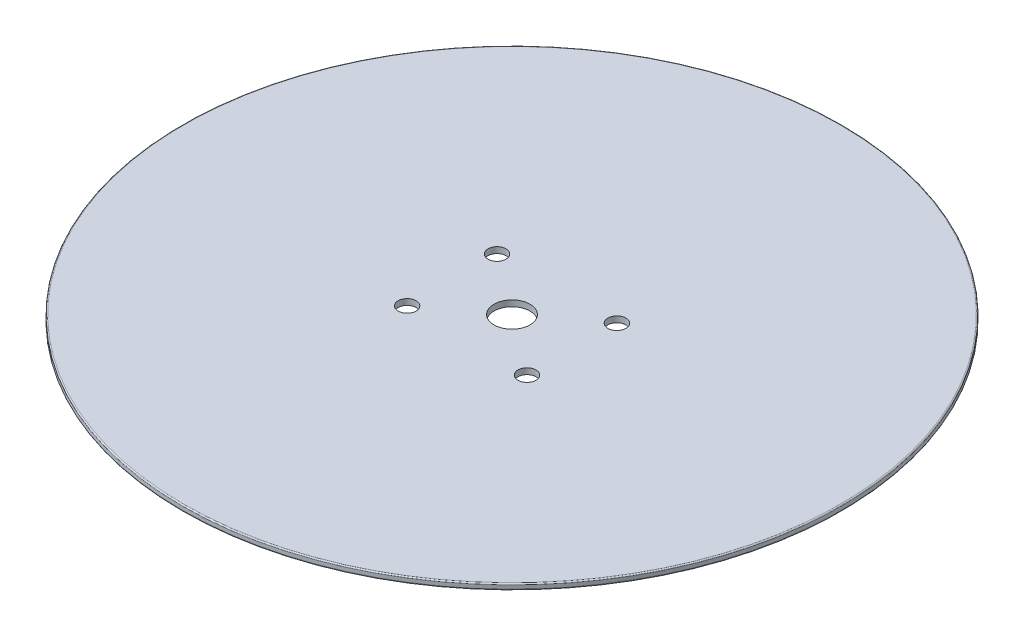
ISO-10303-21;
HEADER;
FILE_DESCRIPTION(('STEP AP214'),'2;1');
FILE_NAME('part.step','',(''),(''),'','','');
FILE_SCHEMA(('AUTOMOTIVE_DESIGN { 1 0 10303 214 1 1 1 1 }'));
ENDSEC;
DATA;
#1=APPLICATION_CONTEXT('core data for automotive mechanical design processes');
#2=APPLICATION_PROTOCOL_DEFINITION('international standard','automotive_design',2000,#1);
#3=PRODUCT_CONTEXT('',#1,'mechanical');
#4=PRODUCT('Part','Part','',(#3));
#5=PRODUCT_RELATED_PRODUCT_CATEGORY('part','',(#4));
#6=PRODUCT_DEFINITION_FORMATION('','',#4);
#7=PRODUCT_DEFINITION_CONTEXT('part definition',#1,'design');
#8=PRODUCT_DEFINITION('design','',#6,#7);
#9=PRODUCT_DEFINITION_SHAPE('','',#8);
#10=(LENGTH_UNIT() NAMED_UNIT(*) SI_UNIT(.MILLI.,.METRE.));
#11=(NAMED_UNIT(*) PLANE_ANGLE_UNIT() SI_UNIT($,.RADIAN.));
#12=(NAMED_UNIT(*) SI_UNIT($,.STERADIAN.) SOLID_ANGLE_UNIT());
#13=UNCERTAINTY_MEASURE_WITH_UNIT(LENGTH_MEASURE(1.E-05),#10,'distance_accuracy_value','');
#14=(GEOMETRIC_REPRESENTATION_CONTEXT(3) GLOBAL_UNCERTAINTY_ASSIGNED_CONTEXT((#13)) GLOBAL_UNIT_ASSIGNED_CONTEXT((#10,
#11,#12)) REPRESENTATION_CONTEXT('',''));
#15=CARTESIAN_POINT('',(0.,0.,0.));
#16=DIRECTION('',(0.,0.,1.));
#17=DIRECTION('',(1.,0.,0.));
#18=AXIS2_PLACEMENT_3D('',#15,#16,#17);
#19=CARTESIAN_POINT('',(0.,1.,0.));
#20=DIRECTION('',(0.,-1.,0.));
#21=DIRECTION('',(0.,0.,-1.));
#22=AXIS2_PLACEMENT_3D('',#19,#20,#21);
#23=CYLINDRICAL_SURFACE('',#22,55.);
#24=CARTESIAN_POINT('',(0.,0.8,0.));
#25=DIRECTION('',(0.,1.,0.));
#26=DIRECTION('',(0.,0.,1.));
#27=AXIS2_PLACEMENT_3D('',#24,#25,#26);
#28=CIRCLE('',#27,55.);
#29=CARTESIAN_POINT('',(0.,0.8,55.));
#30=VERTEX_POINT('',#29);
#31=EDGE_CURVE('E37',#30,#30,#28,.F.);
#32=ORIENTED_EDGE('',*,*,#31,.T.);
#33=EDGE_LOOP('',(#32));
#34=FACE_BOUND('',#33,.T.);
#35=CARTESIAN_POINT('',(0.,0.2,0.));
#36=DIRECTION('',(0.,1.,0.));
#37=DIRECTION('',(0.,0.,1.));
#38=AXIS2_PLACEMENT_3D('',#35,#36,#37);
#39=CIRCLE('',#38,55.);
#40=CARTESIAN_POINT('',(0.,0.2,55.));
#41=VERTEX_POINT('',#40);
#42=EDGE_CURVE('E41',#41,#41,#39,.T.);
#43=ORIENTED_EDGE('',*,*,#42,.T.);
#44=EDGE_LOOP('',(#43));
#45=FACE_BOUND('',#44,.T.);
#46=ADVANCED_FACE('F30',(#34,#45),#23,.T.);
#47=CARTESIAN_POINT('',(0.,1.,0.));
#48=DIRECTION('',(0.,1.,0.));
#49=DIRECTION('',(0.,0.,1.));
#50=AXIS2_PLACEMENT_3D('',#47,#48,#49);
#51=PLANE('',#50);
#52=CARTESIAN_POINT('',(-10.,1.,7.5));
#53=DIRECTION('',(0.,1.,0.));
#54=DIRECTION('',(0.,0.,1.));
#55=AXIS2_PLACEMENT_3D('',#52,#53,#54);
#56=CIRCLE('',#55,1.5);
#57=CARTESIAN_POINT('',(-10.,1.,9.));
#58=VERTEX_POINT('',#57);
#59=EDGE_CURVE('E75',#58,#58,#56,.T.);
#60=ORIENTED_EDGE('',*,*,#59,.F.);
#61=EDGE_LOOP('',(#60));
#62=FACE_BOUND('',#61,.T.);
#63=CARTESIAN_POINT('',(10.,1.,7.5));
#64=DIRECTION('',(0.,1.,0.));
#65=DIRECTION('',(0.,0.,1.));
#66=AXIS2_PLACEMENT_3D('',#63,#64,#65);
#67=CIRCLE('',#66,1.5);
#68=CARTESIAN_POINT('',(10.,1.,9.));
#69=VERTEX_POINT('',#68);
#70=EDGE_CURVE('E69',#69,#69,#67,.T.);
#71=ORIENTED_EDGE('',*,*,#70,.F.);
#72=EDGE_LOOP('',(#71));
#73=FACE_BOUND('',#72,.T.);
#74=CARTESIAN_POINT('',(10.,1.,-7.5));
#75=DIRECTION('',(0.,1.,0.));
#76=DIRECTION('',(0.,0.,1.));
#77=AXIS2_PLACEMENT_3D('',#74,#75,#76);
#78=CIRCLE('',#77,1.5);
#79=CARTESIAN_POINT('',(10.,1.,-6.));
#80=VERTEX_POINT('',#79);
#81=EDGE_CURVE('E63',#80,#80,#78,.T.);
#82=ORIENTED_EDGE('',*,*,#81,.F.);
#83=EDGE_LOOP('',(#82));
#84=FACE_BOUND('',#83,.T.);
#85=CARTESIAN_POINT('',(-10.,1.,-7.5));
#86=DIRECTION('',(0.,1.,0.));
#87=DIRECTION('',(0.,0.,1.));
#88=AXIS2_PLACEMENT_3D('',#85,#86,#87);
#89=CIRCLE('',#88,1.5);
#90=CARTESIAN_POINT('',(-10.,1.,-6.));
#91=VERTEX_POINT('',#90);
#92=EDGE_CURVE('E57',#91,#91,#89,.T.);
#93=ORIENTED_EDGE('',*,*,#92,.F.);
#94=EDGE_LOOP('',(#93));
#95=FACE_BOUND('',#94,.T.);
#96=CARTESIAN_POINT('',(0.,1.,0.));
#97=DIRECTION('',(0.,1.,0.));
#98=DIRECTION('',(0.,0.,1.));
#99=AXIS2_PLACEMENT_3D('',#96,#97,#98);
#100=CIRCLE('',#99,3.);
#101=CARTESIAN_POINT('',(0.,1.,3.));
#102=VERTEX_POINT('',#101);
#103=EDGE_CURVE('E51',#102,#102,#100,.T.);
#104=ORIENTED_EDGE('',*,*,#103,.F.);
#105=EDGE_LOOP('',(#104));
#106=FACE_BOUND('',#105,.T.);
#107=CARTESIAN_POINT('',(0.,1.,0.));
#108=DIRECTION('',(0.,1.,0.));
#109=DIRECTION('',(0.,0.,1.));
#110=AXIS2_PLACEMENT_3D('',#107,#108,#109);
#111=CIRCLE('',#110,54.8);
#112=CARTESIAN_POINT('',(0.,1.,54.8));
#113=VERTEX_POINT('',#112);
#114=EDGE_CURVE('E45',#113,#113,#111,.T.);
#115=ORIENTED_EDGE('',*,*,#114,.T.);
#116=EDGE_LOOP('',(#115));
#117=FACE_BOUND('',#116,.T.);
#118=ADVANCED_FACE('F91',(#62,#73,#84,#95,#106,#117),#51,.T.);
#119=CARTESIAN_POINT('',(0.,0.,0.));
#120=DIRECTION('',(0.,1.,0.));
#121=DIRECTION('',(0.,0.,1.));
#122=AXIS2_PLACEMENT_3D('',#119,#120,#121);
#123=PLANE('',#122);
#124=CARTESIAN_POINT('',(-10.,0.,7.5));
#125=DIRECTION('',(0.,1.,0.));
#126=DIRECTION('',(0.,0.,1.));
#127=AXIS2_PLACEMENT_3D('',#124,#125,#126);
#128=CIRCLE('',#127,1.5);
#129=CARTESIAN_POINT('',(-10.,0.,9.));
#130=VERTEX_POINT('',#129);
#131=EDGE_CURVE('E72',#130,#130,#128,.T.);
#132=ORIENTED_EDGE('',*,*,#131,.T.);
#133=EDGE_LOOP('',(#132));
#134=FACE_BOUND('',#133,.T.);
#135=CARTESIAN_POINT('',(10.,0.,7.5));
#136=DIRECTION('',(0.,1.,0.));
#137=DIRECTION('',(0.,0.,1.));
#138=AXIS2_PLACEMENT_3D('',#135,#136,#137);
#139=CIRCLE('',#138,1.5);
#140=CARTESIAN_POINT('',(10.,0.,9.));
#141=VERTEX_POINT('',#140);
#142=EDGE_CURVE('E66',#141,#141,#139,.T.);
#143=ORIENTED_EDGE('',*,*,#142,.T.);
#144=EDGE_LOOP('',(#143));
#145=FACE_BOUND('',#144,.T.);
#146=CARTESIAN_POINT('',(10.,0.,-7.5));
#147=DIRECTION('',(0.,1.,0.));
#148=DIRECTION('',(0.,0.,1.));
#149=AXIS2_PLACEMENT_3D('',#146,#147,#148);
#150=CIRCLE('',#149,1.5);
#151=CARTESIAN_POINT('',(10.,0.,-6.));
#152=VERTEX_POINT('',#151);
#153=EDGE_CURVE('E60',#152,#152,#150,.T.);
#154=ORIENTED_EDGE('',*,*,#153,.T.);
#155=EDGE_LOOP('',(#154));
#156=FACE_BOUND('',#155,.T.);
#157=CARTESIAN_POINT('',(-10.,0.,-7.5));
#158=DIRECTION('',(0.,1.,0.));
#159=DIRECTION('',(0.,0.,1.));
#160=AXIS2_PLACEMENT_3D('',#157,#158,#159);
#161=CIRCLE('',#160,1.5);
#162=CARTESIAN_POINT('',(-10.,0.,-6.));
#163=VERTEX_POINT('',#162);
#164=EDGE_CURVE('E54',#163,#163,#161,.T.);
#165=ORIENTED_EDGE('',*,*,#164,.T.);
#166=EDGE_LOOP('',(#165));
#167=FACE_BOUND('',#166,.T.);
#168=CARTESIAN_POINT('',(0.,0.,0.));
#169=DIRECTION('',(0.,1.,0.));
#170=DIRECTION('',(0.,0.,1.));
#171=AXIS2_PLACEMENT_3D('',#168,#169,#170);
#172=CIRCLE('',#171,3.);
#173=CARTESIAN_POINT('',(0.,0.,3.));
#174=VERTEX_POINT('',#173);
#175=EDGE_CURVE('E50',#174,#174,#172,.T.);
#176=ORIENTED_EDGE('',*,*,#175,.T.);
#177=EDGE_LOOP('',(#176));
#178=FACE_BOUND('',#177,.T.);
#179=CARTESIAN_POINT('',(0.,0.,0.));
#180=DIRECTION('',(0.,1.,0.));
#181=DIRECTION('',(0.,0.,1.));
#182=AXIS2_PLACEMENT_3D('',#179,#180,#181);
#183=CIRCLE('',#182,54.8);
#184=CARTESIAN_POINT('',(0.,0.,54.8));
#185=VERTEX_POINT('',#184);
#186=EDGE_CURVE('E10',#185,#185,#183,.F.);
#187=ORIENTED_EDGE('',*,*,#186,.T.);
#188=EDGE_LOOP('',(#187));
#189=FACE_BOUND('',#188,.T.);
#190=ADVANCED_FACE('F81',(#134,#145,#156,#167,#178,#189),#123,.F.);
#191=CARTESIAN_POINT('',(0.,0.8,0.));
#192=DIRECTION('',(0.,1.,0.));
#193=DIRECTION('',(0.,0.,1.));
#194=AXIS2_PLACEMENT_3D('',#191,#192,#193);
#195=TOROIDAL_SURFACE('',#194,54.8,0.2);
#196=ORIENTED_EDGE('',*,*,#31,.F.);
#197=EDGE_LOOP('',(#196));
#198=FACE_BOUND('',#197,.T.);
#199=ORIENTED_EDGE('',*,*,#114,.F.);
#200=EDGE_LOOP('',(#199));
#201=FACE_BOUND('',#200,.T.);
#202=ADVANCED_FACE('F105',(#198,#201),#195,.T.);
#203=CARTESIAN_POINT('',(0.,0.2,0.));
#204=DIRECTION('',(0.,1.,0.));
#205=DIRECTION('',(0.,0.,1.));
#206=AXIS2_PLACEMENT_3D('',#203,#204,#205);
#207=TOROIDAL_SURFACE('',#206,54.8,0.2);
#208=ORIENTED_EDGE('',*,*,#186,.F.);
#209=EDGE_LOOP('',(#208));
#210=FACE_BOUND('',#209,.T.);
#211=ORIENTED_EDGE('',*,*,#42,.F.);
#212=EDGE_LOOP('',(#211));
#213=FACE_BOUND('',#212,.T.);
#214=ADVANCED_FACE('F32',(#210,#213),#207,.T.);
#215=CARTESIAN_POINT('',(0.,0.,0.));
#216=DIRECTION('',(0.,1.,0.));
#217=DIRECTION('',(0.,0.,1.));
#218=AXIS2_PLACEMENT_3D('',#215,#216,#217);
#219=CYLINDRICAL_SURFACE('',#218,3.);
#220=ORIENTED_EDGE('',*,*,#175,.F.);
#221=EDGE_LOOP('',(#220));
#222=FACE_BOUND('',#221,.T.);
#223=ORIENTED_EDGE('',*,*,#103,.T.);
#224=EDGE_LOOP('',(#223));
#225=FACE_BOUND('',#224,.T.);
#226=ADVANCED_FACE('F112',(#222,#225),#219,.F.);
#227=CARTESIAN_POINT('',(-10.,0.,-7.5));
#228=DIRECTION('',(0.,1.,0.));
#229=DIRECTION('',(0.,0.,1.));
#230=AXIS2_PLACEMENT_3D('',#227,#228,#229);
#231=CYLINDRICAL_SURFACE('',#230,1.5);
#232=ORIENTED_EDGE('',*,*,#164,.F.);
#233=EDGE_LOOP('',(#232));
#234=FACE_BOUND('',#233,.T.);
#235=ORIENTED_EDGE('',*,*,#92,.T.);
#236=EDGE_LOOP('',(#235));
#237=FACE_BOUND('',#236,.T.);
#238=ADVANCED_FACE('F123',(#234,#237),#231,.F.);
#239=CARTESIAN_POINT('',(10.,0.,-7.5));
#240=DIRECTION('',(0.,1.,0.));
#241=DIRECTION('',(0.,0.,1.));
#242=AXIS2_PLACEMENT_3D('',#239,#240,#241);
#243=CYLINDRICAL_SURFACE('',#242,1.5);
#244=ORIENTED_EDGE('',*,*,#153,.F.);
#245=EDGE_LOOP('',(#244));
#246=FACE_BOUND('',#245,.T.);
#247=ORIENTED_EDGE('',*,*,#81,.T.);
#248=EDGE_LOOP('',(#247));
#249=FACE_BOUND('',#248,.T.);
#250=ADVANCED_FACE('F127',(#246,#249),#243,.F.);
#251=CARTESIAN_POINT('',(10.,0.,7.5));
#252=DIRECTION('',(0.,1.,0.));
#253=DIRECTION('',(0.,0.,1.));
#254=AXIS2_PLACEMENT_3D('',#251,#252,#253);
#255=CYLINDRICAL_SURFACE('',#254,1.5);
#256=ORIENTED_EDGE('',*,*,#142,.F.);
#257=EDGE_LOOP('',(#256));
#258=FACE_BOUND('',#257,.T.);
#259=ORIENTED_EDGE('',*,*,#70,.T.);
#260=EDGE_LOOP('',(#259));
#261=FACE_BOUND('',#260,.T.);
#262=ADVANCED_FACE('F87',(#258,#261),#255,.F.);
#263=CARTESIAN_POINT('',(-10.,0.,7.5));
#264=DIRECTION('',(0.,1.,0.));
#265=DIRECTION('',(0.,0.,1.));
#266=AXIS2_PLACEMENT_3D('',#263,#264,#265);
#267=CYLINDRICAL_SURFACE('',#266,1.5);
#268=ORIENTED_EDGE('',*,*,#131,.F.);
#269=EDGE_LOOP('',(#268));
#270=FACE_BOUND('',#269,.T.);
#271=ORIENTED_EDGE('',*,*,#59,.T.);
#272=EDGE_LOOP('',(#271));
#273=FACE_BOUND('',#272,.T.);
#274=ADVANCED_FACE('F84',(#270,#273),#267,.F.);
#275=CLOSED_SHELL('',(#46,#118,#190,#202,#214,#226,#238,#250,#262,#274));
#276=MANIFOLD_SOLID_BREP('B2',#275);
#277=ADVANCED_BREP_SHAPE_REPRESENTATION('',(#18,#276),#14);
#278=SHAPE_DEFINITION_REPRESENTATION(#9,#277);
ENDSEC;
END-ISO-10303-21;
